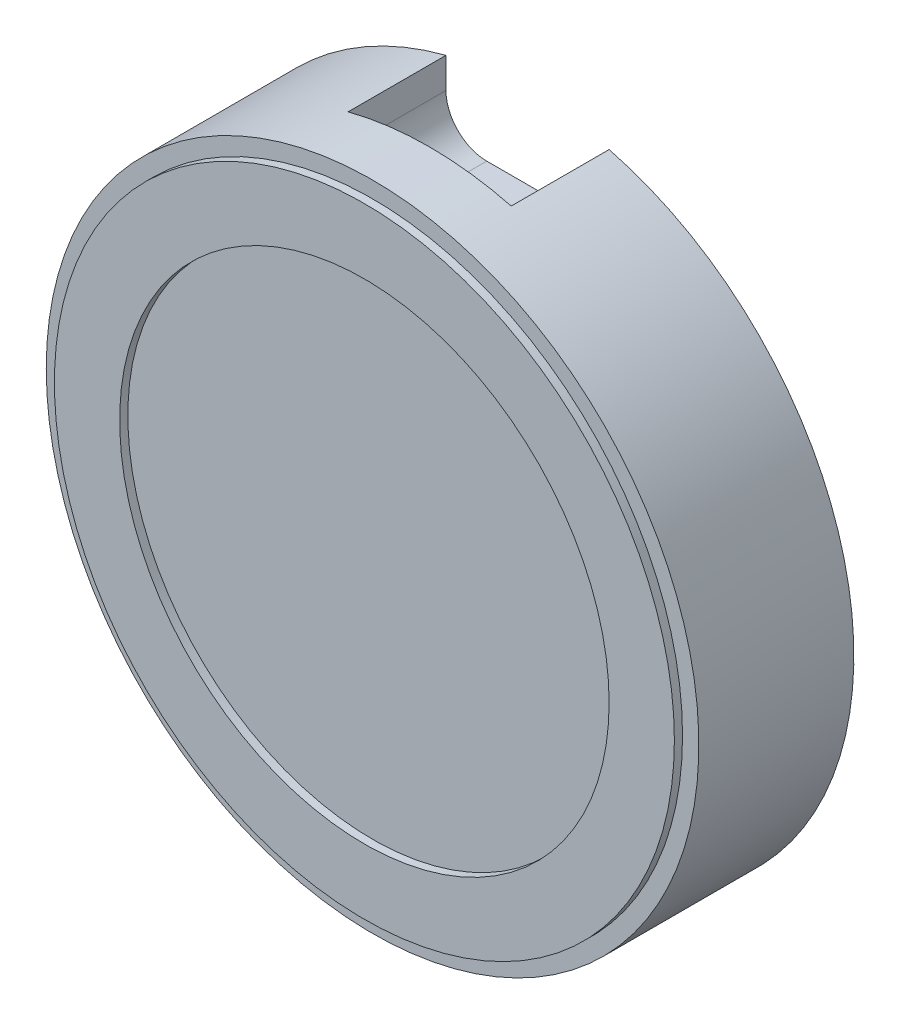
ISO-10303-21;
HEADER;
FILE_DESCRIPTION(('STEP AP214'),'2;1');
FILE_NAME('part.step','',(''),(''),'','','');
FILE_SCHEMA(('AUTOMOTIVE_DESIGN { 1 0 10303 214 1 1 1 1 }'));
ENDSEC;
DATA;
#1=APPLICATION_CONTEXT('core data for automotive mechanical design processes');
#2=APPLICATION_PROTOCOL_DEFINITION('international standard','automotive_design',2000,#1);
#3=PRODUCT_CONTEXT('',#1,'mechanical');
#4=PRODUCT('Part','Part','',(#3));
#5=PRODUCT_RELATED_PRODUCT_CATEGORY('part','',(#4));
#6=PRODUCT_DEFINITION_FORMATION('','',#4);
#7=PRODUCT_DEFINITION_CONTEXT('part definition',#1,'design');
#8=PRODUCT_DEFINITION('design','',#6,#7);
#9=PRODUCT_DEFINITION_SHAPE('','',#8);
#10=(LENGTH_UNIT() NAMED_UNIT(*) SI_UNIT(.MILLI.,.METRE.));
#11=(NAMED_UNIT(*) PLANE_ANGLE_UNIT() SI_UNIT($,.RADIAN.));
#12=(NAMED_UNIT(*) SI_UNIT($,.STERADIAN.) SOLID_ANGLE_UNIT());
#13=UNCERTAINTY_MEASURE_WITH_UNIT(LENGTH_MEASURE(1.E-05),#10,'distance_accuracy_value','');
#14=(GEOMETRIC_REPRESENTATION_CONTEXT(3) GLOBAL_UNCERTAINTY_ASSIGNED_CONTEXT((#13)) GLOBAL_UNIT_ASSIGNED_CONTEXT((#10,
#11,#12)) REPRESENTATION_CONTEXT('',''));
#15=CARTESIAN_POINT('',(0.,0.,0.));
#16=DIRECTION('',(0.,0.,1.));
#17=DIRECTION('',(1.,0.,0.));
#18=AXIS2_PLACEMENT_3D('',#15,#16,#17);
#19=CARTESIAN_POINT('',(0.,0.,-0.5));
#20=DIRECTION('',(0.,0.,1.));
#21=DIRECTION('',(1.,0.,0.));
#22=AXIS2_PLACEMENT_3D('',#19,#20,#21);
#23=CYLINDRICAL_SURFACE('',#22,19.);
#24=CARTESIAN_POINT('',(0.,0.,-0.5));
#25=DIRECTION('',(0.,0.,1.));
#26=DIRECTION('',(1.,0.,0.));
#27=AXIS2_PLACEMENT_3D('',#24,#25,#26);
#28=CIRCLE('',#27,19.);
#29=CARTESIAN_POINT('',(19.,0.,-0.5));
#30=VERTEX_POINT('',#29);
#31=EDGE_CURVE('E155',#30,#30,#28,.T.);
#32=ORIENTED_EDGE('',*,*,#31,.T.);
#33=EDGE_LOOP('',(#32));
#34=FACE_BOUND('',#33,.T.);
#35=CARTESIAN_POINT('',(0.,0.,0.));
#36=DIRECTION('',(0.,0.,1.));
#37=DIRECTION('',(1.,0.,0.));
#38=AXIS2_PLACEMENT_3D('',#35,#36,#37);
#39=CIRCLE('',#38,19.);
#40=CARTESIAN_POINT('',(19.,0.,0.));
#41=VERTEX_POINT('',#40);
#42=EDGE_CURVE('E11',#41,#41,#39,.T.);
#43=ORIENTED_EDGE('',*,*,#42,.F.);
#44=EDGE_LOOP('',(#43));
#45=FACE_BOUND('',#44,.T.);
#46=ADVANCED_FACE('F45',(#34,#45),#23,.T.);
#47=CARTESIAN_POINT('',(0.,0.,0.));
#48=DIRECTION('',(0.,0.,1.));
#49=DIRECTION('',(1.,0.,0.));
#50=AXIS2_PLACEMENT_3D('',#47,#48,#49);
#51=PLANE('',#50);
#52=CARTESIAN_POINT('',(0.,0.,0.));
#53=DIRECTION('',(0.,0.,1.));
#54=DIRECTION('',(1.,0.,0.));
#55=AXIS2_PLACEMENT_3D('',#52,#53,#54);
#56=CIRCLE('',#55,15.);
#57=CARTESIAN_POINT('',(15.,0.,0.));
#58=VERTEX_POINT('',#57);
#59=EDGE_CURVE('E158',#58,#58,#56,.T.);
#60=ORIENTED_EDGE('',*,*,#59,.F.);
#61=EDGE_LOOP('',(#60));
#62=FACE_BOUND('',#61,.T.);
#63=ORIENTED_EDGE('',*,*,#42,.T.);
#64=EDGE_LOOP('',(#63));
#65=FACE_BOUND('',#64,.T.);
#66=ADVANCED_FACE('F188',(#62,#65),#51,.T.);
#67=CARTESIAN_POINT('',(0.,0.,-0.5));
#68=DIRECTION('',(0.,0.,1.));
#69=DIRECTION('',(1.,0.,0.));
#70=AXIS2_PLACEMENT_3D('',#67,#68,#69);
#71=CYLINDRICAL_SURFACE('',#70,15.);
#72=CARTESIAN_POINT('',(0.,0.,-0.5));
#73=DIRECTION('',(0.,0.,1.));
#74=DIRECTION('',(1.,0.,0.));
#75=AXIS2_PLACEMENT_3D('',#72,#73,#74);
#76=CIRCLE('',#75,15.);
#77=CARTESIAN_POINT('',(15.,0.,-0.5));
#78=VERTEX_POINT('',#77);
#79=EDGE_CURVE('E47',#78,#78,#76,.T.);
#80=ORIENTED_EDGE('',*,*,#79,.F.);
#81=EDGE_LOOP('',(#80));
#82=FACE_BOUND('',#81,.T.);
#83=ORIENTED_EDGE('',*,*,#59,.T.);
#84=EDGE_LOOP('',(#83));
#85=FACE_BOUND('',#84,.T.);
#86=ADVANCED_FACE('F169',(#82,#85),#71,.F.);
#87=CARTESIAN_POINT('',(0.,0.,-0.5));
#88=DIRECTION('',(0.,0.,-1.));
#89=DIRECTION('',(-1.,0.,0.));
#90=AXIS2_PLACEMENT_3D('',#87,#88,#89);
#91=PLANE('',#90);
#92=ORIENTED_EDGE('',*,*,#31,.F.);
#93=EDGE_LOOP('',(#92));
#94=FACE_BOUND('',#93,.T.);
#95=CARTESIAN_POINT('',(0.,0.,-0.5));
#96=DIRECTION('',(0.,0.,-1.));
#97=DIRECTION('',(-1.,0.,0.));
#98=AXIS2_PLACEMENT_3D('',#95,#96,#97);
#99=CIRCLE('',#98,20.);
#100=CARTESIAN_POINT('',(-20.,0.,-0.5));
#101=VERTEX_POINT('',#100);
#102=EDGE_CURVE('E143',#101,#101,#99,.T.);
#103=ORIENTED_EDGE('',*,*,#102,.F.);
#104=EDGE_LOOP('',(#103));
#105=FACE_BOUND('',#104,.T.);
#106=ADVANCED_FACE('F164',(#94,#105),#91,.F.);
#107=CARTESIAN_POINT('',(0.,0.,-10.));
#108=DIRECTION('',(0.,0.,-1.));
#109=DIRECTION('',(-1.,0.,0.));
#110=AXIS2_PLACEMENT_3D('',#107,#108,#109);
#111=PLANE('',#110);
#112=CARTESIAN_POINT('',(8.83883476483185,8.83883476483184,-10.));
#113=DIRECTION('',(0.,0.,-1.));
#114=DIRECTION('',(-1.,0.,0.));
#115=AXIS2_PLACEMENT_3D('',#112,#113,#114);
#116=CIRCLE('',#115,1.7);
#117=CARTESIAN_POINT('',(7.13883476483185,8.83883476483184,-10.));
#118=VERTEX_POINT('',#117);
#119=EDGE_CURVE('E360',#118,#118,#116,.T.);
#120=ORIENTED_EDGE('',*,*,#119,.F.);
#121=EDGE_LOOP('',(#120));
#122=FACE_BOUND('',#121,.T.);
#123=CARTESIAN_POINT('',(8.83883476483184,-8.83883476483184,-10.));
#124=DIRECTION('',(0.,0.,-1.));
#125=DIRECTION('',(-1.,0.,0.));
#126=AXIS2_PLACEMENT_3D('',#123,#124,#125);
#127=CIRCLE('',#126,1.7);
#128=CARTESIAN_POINT('',(7.13883476483184,-8.83883476483184,-10.));
#129=VERTEX_POINT('',#128);
#130=EDGE_CURVE('E363',#129,#129,#127,.T.);
#131=ORIENTED_EDGE('',*,*,#130,.F.);
#132=EDGE_LOOP('',(#131));
#133=FACE_BOUND('',#132,.T.);
#134=CARTESIAN_POINT('',(-8.83883476483184,-8.83883476483184,-10.));
#135=DIRECTION('',(0.,0.,-1.));
#136=DIRECTION('',(-1.,0.,0.));
#137=AXIS2_PLACEMENT_3D('',#134,#135,#136);
#138=CIRCLE('',#137,1.7);
#139=CARTESIAN_POINT('',(-10.5388347648318,-8.83883476483184,-10.));
#140=VERTEX_POINT('',#139);
#141=EDGE_CURVE('E367',#140,#140,#138,.T.);
#142=ORIENTED_EDGE('',*,*,#141,.F.);
#143=EDGE_LOOP('',(#142));
#144=FACE_BOUND('',#143,.T.);
#145=CARTESIAN_POINT('',(-8.83883476483184,8.83883476483184,-10.));
#146=DIRECTION('',(0.,0.,-1.));
#147=DIRECTION('',(-1.,0.,0.));
#148=AXIS2_PLACEMENT_3D('',#145,#146,#147);
#149=CIRCLE('',#148,1.7);
#150=CARTESIAN_POINT('',(-10.5388347648318,8.83883476483184,-10.));
#151=VERTEX_POINT('',#150);
#152=EDGE_CURVE('E374',#151,#151,#149,.T.);
#153=ORIENTED_EDGE('',*,*,#152,.F.);
#154=EDGE_LOOP('',(#153));
#155=FACE_BOUND('',#154,.T.);
#156=DIRECTION('',(0.,-1.,0.));
#157=VECTOR('',#156,1.);
#158=CARTESIAN_POINT('',(5.,17.5,-10.));
#159=LINE('',#158,#157);
#160=CARTESIAN_POINT('',(5.,19.3649167310371,-10.));
#161=VERTEX_POINT('',#160);
#162=CARTESIAN_POINT('',(5.,17.5,-10.));
#163=VERTEX_POINT('',#162);
#164=EDGE_CURVE('E132',#161,#163,#159,.T.);
#165=ORIENTED_EDGE('',*,*,#164,.F.);
#166=CARTESIAN_POINT('',(0.,0.,-10.));
#167=DIRECTION('',(0.,0.,-1.));
#168=DIRECTION('',(-1.,0.,0.));
#169=AXIS2_PLACEMENT_3D('',#166,#167,#168);
#170=CIRCLE('',#169,20.);
#171=CARTESIAN_POINT('',(-5.,19.3649167310371,-10.));
#172=VERTEX_POINT('',#171);
#173=EDGE_CURVE('E148',#161,#172,#170,.T.);
#174=ORIENTED_EDGE('',*,*,#173,.T.);
#175=DIRECTION('',(0.,1.,0.));
#176=VECTOR('',#175,1.);
#177=CARTESIAN_POINT('',(-5.,17.5,-10.));
#178=LINE('',#177,#176);
#179=CARTESIAN_POINT('',(-5.,17.5,-10.));
#180=VERTEX_POINT('',#179);
#181=EDGE_CURVE('E87',#180,#172,#178,.T.);
#182=ORIENTED_EDGE('',*,*,#181,.F.);
#183=CARTESIAN_POINT('',(-2.5,17.5,-10.));
#184=DIRECTION('',(0.,0.,-1.));
#185=DIRECTION('',(-1.,0.,0.));
#186=AXIS2_PLACEMENT_3D('',#183,#184,#185);
#187=CIRCLE('',#186,2.5);
#188=CARTESIAN_POINT('',(-2.49999999999998,15.,-10.));
#189=VERTEX_POINT('',#188);
#190=EDGE_CURVE('E139',#189,#180,#187,.T.);
#191=ORIENTED_EDGE('',*,*,#190,.F.);
#192=DIRECTION('',(-1.,0.,0.));
#193=VECTOR('',#192,1.);
#194=CARTESIAN_POINT('',(-2.49999999999998,15.,-10.));
#195=LINE('',#194,#193);
#196=CARTESIAN_POINT('',(2.49999999999998,15.,-10.));
#197=VERTEX_POINT('',#196);
#198=EDGE_CURVE('E138',#197,#189,#195,.T.);
#199=ORIENTED_EDGE('',*,*,#198,.F.);
#200=CARTESIAN_POINT('',(2.5,17.5,-10.));
#201=DIRECTION('',(0.,0.,-1.));
#202=DIRECTION('',(1.,0.,0.));
#203=AXIS2_PLACEMENT_3D('',#200,#201,#202);
#204=CIRCLE('',#203,2.5);
#205=EDGE_CURVE('E115',#163,#197,#204,.T.);
#206=ORIENTED_EDGE('',*,*,#205,.F.);
#207=EDGE_LOOP('',(#165,#174,#182,#191,#199,#206));
#208=FACE_BOUND('',#207,.T.);
#209=ADVANCED_FACE('F166',(#122,#133,#144,#155,#208),#111,.T.);
#210=CARTESIAN_POINT('',(0.,0.,-10.));
#211=DIRECTION('',(0.,0.,1.));
#212=DIRECTION('',(1.,0.,0.));
#213=AXIS2_PLACEMENT_3D('',#210,#211,#212);
#214=CYLINDRICAL_SURFACE('',#213,20.);
#215=CARTESIAN_POINT('',(0.,0.,-4.));
#216=DIRECTION('',(0.,0.,-1.));
#217=DIRECTION('',(-1.,0.,0.));
#218=AXIS2_PLACEMENT_3D('',#215,#216,#217);
#219=CIRCLE('',#218,20.);
#220=CARTESIAN_POINT('',(-5.,19.3649167310371,-4.));
#221=VERTEX_POINT('',#220);
#222=CARTESIAN_POINT('',(5.,19.3649167310371,-4.));
#223=VERTEX_POINT('',#222);
#224=EDGE_CURVE('E127',#221,#223,#219,.T.);
#225=ORIENTED_EDGE('',*,*,#224,.F.);
#226=DIRECTION('',(0.,0.,-1.));
#227=VECTOR('',#226,1.);
#228=CARTESIAN_POINT('',(-5.,19.3649167310371,-4.));
#229=LINE('',#228,#227);
#230=EDGE_CURVE('E141',#221,#172,#229,.T.);
#231=ORIENTED_EDGE('',*,*,#230,.T.);
#232=ORIENTED_EDGE('',*,*,#173,.F.);
#233=DIRECTION('',(0.,0.,-1.));
#234=VECTOR('',#233,1.);
#235=CARTESIAN_POINT('',(5.,19.3649167310371,-4.));
#236=LINE('',#235,#234);
#237=EDGE_CURVE('E135',#223,#161,#236,.T.);
#238=ORIENTED_EDGE('',*,*,#237,.F.);
#239=EDGE_LOOP('',(#225,#231,#232,#238));
#240=FACE_BOUND('',#239,.T.);
#241=ORIENTED_EDGE('',*,*,#102,.T.);
#242=EDGE_LOOP('',(#241));
#243=FACE_BOUND('',#242,.T.);
#244=ADVANCED_FACE('F172',(#240,#243),#214,.T.);
#245=ORIENTED_EDGE('',*,*,#79,.T.);
#246=EDGE_LOOP('',(#245));
#247=FACE_BOUND('',#246,.T.);
#248=ADVANCED_FACE('F171',(#247),#91,.F.);
#249=CARTESIAN_POINT('',(-5.,17.5,-4.));
#250=DIRECTION('',(-1.,0.,0.));
#251=DIRECTION('',(0.,-1.,0.));
#252=AXIS2_PLACEMENT_3D('',#249,#250,#251);
#253=PLANE('',#252);
#254=ORIENTED_EDGE('',*,*,#181,.T.);
#255=ORIENTED_EDGE('',*,*,#230,.F.);
#256=DIRECTION('',(0.,1.,0.));
#257=VECTOR('',#256,1.);
#258=CARTESIAN_POINT('',(-5.,17.5,-4.));
#259=LINE('',#258,#257);
#260=CARTESIAN_POINT('',(-5.,17.5,-4.));
#261=VERTEX_POINT('',#260);
#262=EDGE_CURVE('E57',#261,#221,#259,.T.);
#263=ORIENTED_EDGE('',*,*,#262,.F.);
#264=DIRECTION('',(0.,0.,-1.));
#265=VECTOR('',#264,1.);
#266=CARTESIAN_POINT('',(-5.,17.5,-4.));
#267=LINE('',#266,#265);
#268=EDGE_CURVE('E63',#261,#180,#267,.T.);
#269=ORIENTED_EDGE('',*,*,#268,.T.);
#270=EDGE_LOOP('',(#254,#255,#263,#269));
#271=FACE_BOUND('',#270,.T.);
#272=ADVANCED_FACE('F185',(#271),#253,.F.);
#273=CARTESIAN_POINT('',(-2.5,17.5,-4.));
#274=DIRECTION('',(0.,0.,-1.));
#275=DIRECTION('',(-1.,0.,0.));
#276=AXIS2_PLACEMENT_3D('',#273,#274,#275);
#277=CYLINDRICAL_SURFACE('',#276,2.5);
#278=ORIENTED_EDGE('',*,*,#190,.T.);
#279=ORIENTED_EDGE('',*,*,#268,.F.);
#280=CARTESIAN_POINT('',(-2.5,17.5,-4.));
#281=DIRECTION('',(0.,0.,-1.));
#282=DIRECTION('',(-1.,0.,0.));
#283=AXIS2_PLACEMENT_3D('',#280,#281,#282);
#284=CIRCLE('',#283,2.5);
#285=CARTESIAN_POINT('',(-2.49999999999998,15.,-4.));
#286=VERTEX_POINT('',#285);
#287=EDGE_CURVE('E125',#286,#261,#284,.T.);
#288=ORIENTED_EDGE('',*,*,#287,.F.);
#289=DIRECTION('',(0.,0.,-1.));
#290=VECTOR('',#289,1.);
#291=CARTESIAN_POINT('',(-2.49999999999998,15.,-4.));
#292=LINE('',#291,#290);
#293=EDGE_CURVE('E116',#286,#189,#292,.T.);
#294=ORIENTED_EDGE('',*,*,#293,.T.);
#295=EDGE_LOOP('',(#278,#279,#288,#294));
#296=FACE_BOUND('',#295,.T.);
#297=ADVANCED_FACE('F230',(#296),#277,.F.);
#298=CARTESIAN_POINT('',(-2.49999999999998,15.,-4.));
#299=DIRECTION('',(0.,-1.,0.));
#300=DIRECTION('',(0.,0.,-1.));
#301=AXIS2_PLACEMENT_3D('',#298,#299,#300);
#302=PLANE('',#301);
#303=ORIENTED_EDGE('',*,*,#198,.T.);
#304=ORIENTED_EDGE('',*,*,#293,.F.);
#305=DIRECTION('',(-1.,0.,0.));
#306=VECTOR('',#305,1.);
#307=CARTESIAN_POINT('',(-2.49999999999998,15.,-4.));
#308=LINE('',#307,#306);
#309=CARTESIAN_POINT('',(2.49999999999998,15.,-4.));
#310=VERTEX_POINT('',#309);
#311=EDGE_CURVE('E119',#310,#286,#308,.T.);
#312=ORIENTED_EDGE('',*,*,#311,.F.);
#313=DIRECTION('',(0.,0.,-1.));
#314=VECTOR('',#313,1.);
#315=CARTESIAN_POINT('',(2.49999999999998,15.,-4.));
#316=LINE('',#315,#314);
#317=EDGE_CURVE('E106',#310,#197,#316,.T.);
#318=ORIENTED_EDGE('',*,*,#317,.T.);
#319=EDGE_LOOP('',(#303,#304,#312,#318));
#320=FACE_BOUND('',#319,.T.);
#321=ADVANCED_FACE('F122',(#320),#302,.F.);
#322=CARTESIAN_POINT('',(2.5,17.5,-4.));
#323=DIRECTION('',(0.,0.,-1.));
#324=DIRECTION('',(-1.,0.,0.));
#325=AXIS2_PLACEMENT_3D('',#322,#323,#324);
#326=CYLINDRICAL_SURFACE('',#325,2.5);
#327=ORIENTED_EDGE('',*,*,#205,.T.);
#328=ORIENTED_EDGE('',*,*,#317,.F.);
#329=CARTESIAN_POINT('',(2.5,17.5,-4.));
#330=DIRECTION('',(0.,0.,-1.));
#331=DIRECTION('',(1.,0.,0.));
#332=AXIS2_PLACEMENT_3D('',#329,#330,#331);
#333=CIRCLE('',#332,2.5);
#334=CARTESIAN_POINT('',(5.,17.5,-4.));
#335=VERTEX_POINT('',#334);
#336=EDGE_CURVE('E109',#335,#310,#333,.T.);
#337=ORIENTED_EDGE('',*,*,#336,.F.);
#338=DIRECTION('',(0.,0.,-1.));
#339=VECTOR('',#338,1.);
#340=CARTESIAN_POINT('',(5.,17.5,-4.));
#341=LINE('',#340,#339);
#342=EDGE_CURVE('E120',#335,#163,#341,.T.);
#343=ORIENTED_EDGE('',*,*,#342,.T.);
#344=EDGE_LOOP('',(#327,#328,#337,#343));
#345=FACE_BOUND('',#344,.T.);
#346=ADVANCED_FACE('F108',(#345),#326,.F.);
#347=CARTESIAN_POINT('',(5.,17.5,-4.));
#348=DIRECTION('',(1.,0.,0.));
#349=DIRECTION('',(0.,1.,0.));
#350=AXIS2_PLACEMENT_3D('',#347,#348,#349);
#351=PLANE('',#350);
#352=ORIENTED_EDGE('',*,*,#164,.T.);
#353=ORIENTED_EDGE('',*,*,#342,.F.);
#354=DIRECTION('',(0.,-1.,0.));
#355=VECTOR('',#354,1.);
#356=CARTESIAN_POINT('',(5.,17.5,-4.));
#357=LINE('',#356,#355);
#358=EDGE_CURVE('E96',#223,#335,#357,.T.);
#359=ORIENTED_EDGE('',*,*,#358,.F.);
#360=ORIENTED_EDGE('',*,*,#237,.T.);
#361=EDGE_LOOP('',(#352,#353,#359,#360));
#362=FACE_BOUND('',#361,.T.);
#363=ADVANCED_FACE('F251',(#362),#351,.F.);
#364=CARTESIAN_POINT('',(0.,0.,-4.));
#365=DIRECTION('',(0.,0.,-1.));
#366=DIRECTION('',(-1.,0.,0.));
#367=AXIS2_PLACEMENT_3D('',#364,#365,#366);
#368=PLANE('',#367);
#369=ORIENTED_EDGE('',*,*,#224,.T.);
#370=ORIENTED_EDGE('',*,*,#358,.T.);
#371=ORIENTED_EDGE('',*,*,#336,.T.);
#372=ORIENTED_EDGE('',*,*,#311,.T.);
#373=ORIENTED_EDGE('',*,*,#287,.T.);
#374=ORIENTED_EDGE('',*,*,#262,.T.);
#375=EDGE_LOOP('',(#369,#370,#371,#372,#373,#374));
#376=FACE_BOUND('',#375,.T.);
#377=ADVANCED_FACE('F121',(#376),#368,.T.);
#378=CARTESIAN_POINT('',(-8.83883476483184,8.83883476483184,-5.));
#379=DIRECTION('',(0.,0.,-1.));
#380=DIRECTION('',(-1.,0.,0.));
#381=AXIS2_PLACEMENT_3D('',#378,#379,#380);
#382=CONICAL_SURFACE('',#381,1.7,1.02974425867665);
#383=CARTESIAN_POINT('',(-8.83883476483185,8.83883476483184,-3.97853694765315));
#384=VERTEX_POINT('',#383);
#385=VERTEX_LOOP('',#384);
#386=FACE_BOUND('',#385,.T.);
#387=CARTESIAN_POINT('',(-8.83883476483184,8.83883476483184,-5.));
#388=DIRECTION('',(0.,0.,-1.));
#389=DIRECTION('',(-1.,0.,0.));
#390=AXIS2_PLACEMENT_3D('',#387,#388,#389);
#391=CIRCLE('',#390,1.7);
#392=CARTESIAN_POINT('',(-10.5388347648318,8.83883476483184,-5.));
#393=VERTEX_POINT('',#392);
#394=EDGE_CURVE('E136',#393,#393,#391,.T.);
#395=ORIENTED_EDGE('',*,*,#394,.T.);
#396=EDGE_LOOP('',(#395));
#397=FACE_BOUND('',#396,.T.);
#398=ADVANCED_FACE('F272',(#386,#397),#382,.F.);
#399=CARTESIAN_POINT('',(-8.83883476483184,8.83883476483184,-10.));
#400=DIRECTION('',(0.,0.,-1.));
#401=DIRECTION('',(-1.,0.,0.));
#402=AXIS2_PLACEMENT_3D('',#399,#400,#401);
#403=CYLINDRICAL_SURFACE('',#402,1.7);
#404=ORIENTED_EDGE('',*,*,#394,.F.);
#405=EDGE_LOOP('',(#404));
#406=FACE_BOUND('',#405,.T.);
#407=ORIENTED_EDGE('',*,*,#152,.T.);
#408=EDGE_LOOP('',(#407));
#409=FACE_BOUND('',#408,.T.);
#410=ADVANCED_FACE('F278',(#406,#409),#403,.F.);
#411=CARTESIAN_POINT('',(-8.83883476483184,-8.83883476483184,-5.));
#412=DIRECTION('',(0.,0.,-1.));
#413=DIRECTION('',(-1.,0.,0.));
#414=AXIS2_PLACEMENT_3D('',#411,#412,#413);
#415=CONICAL_SURFACE('',#414,1.7,1.02974425867665);
#416=CARTESIAN_POINT('',(-8.83883476483185,-8.83883476483184,-3.97853694765315));
#417=VERTEX_POINT('',#416);
#418=VERTEX_LOOP('',#417);
#419=FACE_BOUND('',#418,.T.);
#420=CARTESIAN_POINT('',(-8.83883476483184,-8.83883476483184,-5.));
#421=DIRECTION('',(0.,0.,-1.));
#422=DIRECTION('',(-1.,0.,0.));
#423=AXIS2_PLACEMENT_3D('',#420,#421,#422);
#424=CIRCLE('',#423,1.7);
#425=CARTESIAN_POINT('',(-10.5388347648318,-8.83883476483184,-5.));
#426=VERTEX_POINT('',#425);
#427=EDGE_CURVE('E375',#426,#426,#424,.T.);
#428=ORIENTED_EDGE('',*,*,#427,.T.);
#429=EDGE_LOOP('',(#428));
#430=FACE_BOUND('',#429,.T.);
#431=ADVANCED_FACE('F286',(#419,#430),#415,.F.);
#432=CARTESIAN_POINT('',(-8.83883476483184,-8.83883476483184,-10.));
#433=DIRECTION('',(0.,0.,-1.));
#434=DIRECTION('',(-1.,0.,0.));
#435=AXIS2_PLACEMENT_3D('',#432,#433,#434);
#436=CYLINDRICAL_SURFACE('',#435,1.7);
#437=ORIENTED_EDGE('',*,*,#427,.F.);
#438=EDGE_LOOP('',(#437));
#439=FACE_BOUND('',#438,.T.);
#440=ORIENTED_EDGE('',*,*,#141,.T.);
#441=EDGE_LOOP('',(#440));
#442=FACE_BOUND('',#441,.T.);
#443=ADVANCED_FACE('F297',(#439,#442),#436,.F.);
#444=CARTESIAN_POINT('',(8.83883476483184,-8.83883476483184,-5.));
#445=DIRECTION('',(0.,0.,-1.));
#446=DIRECTION('',(-1.,0.,0.));
#447=AXIS2_PLACEMENT_3D('',#444,#445,#446);
#448=CONICAL_SURFACE('',#447,1.7,1.02974425867665);
#449=CARTESIAN_POINT('',(8.83883476483184,-8.83883476483184,-3.97853694765315));
#450=VERTEX_POINT('',#449);
#451=VERTEX_LOOP('',#450);
#452=FACE_BOUND('',#451,.T.);
#453=CARTESIAN_POINT('',(8.83883476483184,-8.83883476483184,-5.));
#454=DIRECTION('',(0.,0.,-1.));
#455=DIRECTION('',(-1.,0.,0.));
#456=AXIS2_PLACEMENT_3D('',#453,#454,#455);
#457=CIRCLE('',#456,1.7);
#458=CARTESIAN_POINT('',(7.13883476483185,-8.83883476483184,-5.));
#459=VERTEX_POINT('',#458);
#460=EDGE_CURVE('E366',#459,#459,#457,.T.);
#461=ORIENTED_EDGE('',*,*,#460,.T.);
#462=EDGE_LOOP('',(#461));
#463=FACE_BOUND('',#462,.T.);
#464=ADVANCED_FACE('F309',(#452,#463),#448,.F.);
#465=CARTESIAN_POINT('',(8.83883476483184,-8.83883476483184,-10.));
#466=DIRECTION('',(0.,0.,-1.));
#467=DIRECTION('',(-1.,0.,0.));
#468=AXIS2_PLACEMENT_3D('',#465,#466,#467);
#469=CYLINDRICAL_SURFACE('',#468,1.7);
#470=ORIENTED_EDGE('',*,*,#460,.F.);
#471=EDGE_LOOP('',(#470));
#472=FACE_BOUND('',#471,.T.);
#473=ORIENTED_EDGE('',*,*,#130,.T.);
#474=EDGE_LOOP('',(#473));
#475=FACE_BOUND('',#474,.T.);
#476=ADVANCED_FACE('F318',(#472,#475),#469,.F.);
#477=CARTESIAN_POINT('',(8.83883476483185,8.83883476483184,-5.));
#478=DIRECTION('',(0.,0.,-1.));
#479=DIRECTION('',(-1.,0.,0.));
#480=AXIS2_PLACEMENT_3D('',#477,#478,#479);
#481=CONICAL_SURFACE('',#480,1.7,1.02974425867665);
#482=CARTESIAN_POINT('',(8.83883476483184,8.83883476483184,-3.97853694765315));
#483=VERTEX_POINT('',#482);
#484=VERTEX_LOOP('',#483);
#485=FACE_BOUND('',#484,.T.);
#486=CARTESIAN_POINT('',(8.83883476483185,8.83883476483184,-5.));
#487=DIRECTION('',(0.,0.,-1.));
#488=DIRECTION('',(-1.,0.,0.));
#489=AXIS2_PLACEMENT_3D('',#486,#487,#488);
#490=CIRCLE('',#489,1.7);
#491=CARTESIAN_POINT('',(7.13883476483185,8.83883476483184,-5.));
#492=VERTEX_POINT('',#491);
#493=EDGE_CURVE('E358',#492,#492,#490,.T.);
#494=ORIENTED_EDGE('',*,*,#493,.T.);
#495=EDGE_LOOP('',(#494));
#496=FACE_BOUND('',#495,.T.);
#497=ADVANCED_FACE('F329',(#485,#496),#481,.F.);
#498=CARTESIAN_POINT('',(8.83883476483185,8.83883476483184,-10.));
#499=DIRECTION('',(0.,0.,-1.));
#500=DIRECTION('',(-1.,0.,0.));
#501=AXIS2_PLACEMENT_3D('',#498,#499,#500);
#502=CYLINDRICAL_SURFACE('',#501,1.7);
#503=ORIENTED_EDGE('',*,*,#493,.F.);
#504=EDGE_LOOP('',(#503));
#505=FACE_BOUND('',#504,.T.);
#506=ORIENTED_EDGE('',*,*,#119,.T.);
#507=EDGE_LOOP('',(#506));
#508=FACE_BOUND('',#507,.T.);
#509=ADVANCED_FACE('F338',(#505,#508),#502,.F.);
#510=CLOSED_SHELL('',(#46,#66,#86,#106,#209,#244,#248,#272,#297,#321,#346,#363,#377,#398,#410,
#431,#443,#464,#476,#497,#509));
#511=MANIFOLD_SOLID_BREP('B2',#510);
#512=ADVANCED_BREP_SHAPE_REPRESENTATION('',(#18,#511),#14);
#513=SHAPE_DEFINITION_REPRESENTATION(#9,#512);
ENDSEC;
END-ISO-10303-21;
